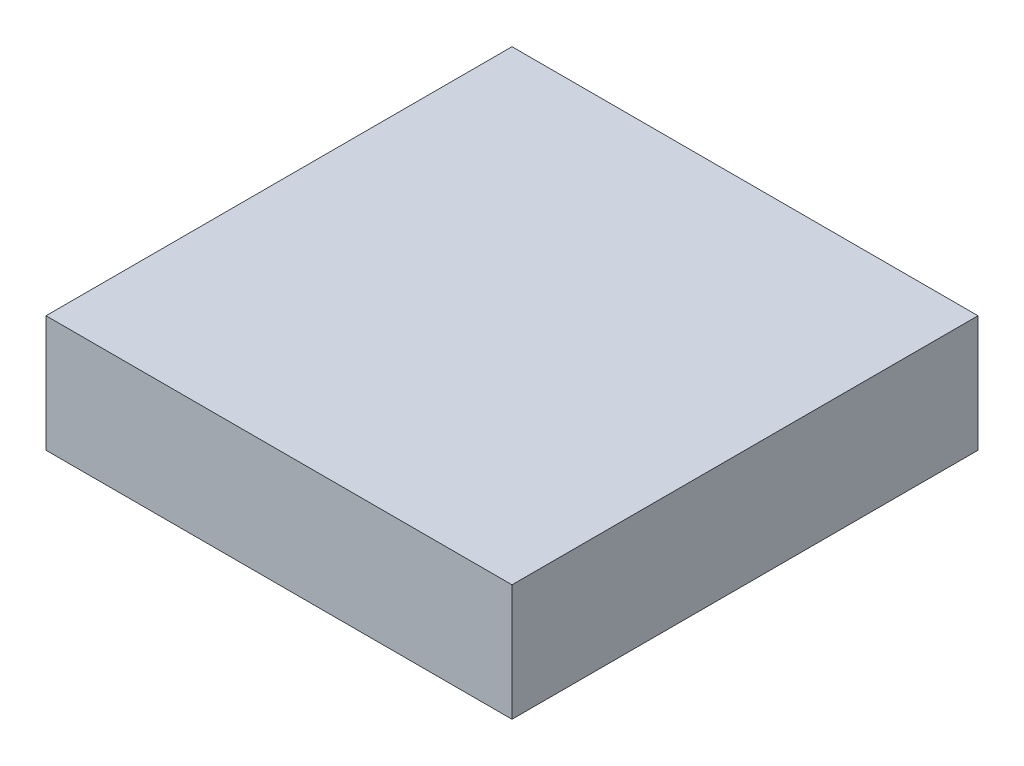
ISO-10303-21;
HEADER;
FILE_DESCRIPTION(('STEP AP214'),'2;1');
FILE_NAME('part.step','',(''),(''),'','','');
FILE_SCHEMA(('AUTOMOTIVE_DESIGN { 1 0 10303 214 1 1 1 1 }'));
ENDSEC;
DATA;
#1=APPLICATION_CONTEXT('core data for automotive mechanical design processes');
#2=APPLICATION_PROTOCOL_DEFINITION('international standard','automotive_design',2000,#1);
#3=PRODUCT_CONTEXT('',#1,'mechanical');
#4=PRODUCT('Part','Part','',(#3));
#5=PRODUCT_RELATED_PRODUCT_CATEGORY('part','',(#4));
#6=PRODUCT_DEFINITION_FORMATION('','',#4);
#7=PRODUCT_DEFINITION_CONTEXT('part definition',#1,'design');
#8=PRODUCT_DEFINITION('design','',#6,#7);
#9=PRODUCT_DEFINITION_SHAPE('','',#8);
#10=(LENGTH_UNIT() NAMED_UNIT(*) SI_UNIT(.MILLI.,.METRE.));
#11=(NAMED_UNIT(*) PLANE_ANGLE_UNIT() SI_UNIT($,.RADIAN.));
#12=(NAMED_UNIT(*) SI_UNIT($,.STERADIAN.) SOLID_ANGLE_UNIT());
#13=UNCERTAINTY_MEASURE_WITH_UNIT(LENGTH_MEASURE(1.E-05),#10,'distance_accuracy_value','');
#14=(GEOMETRIC_REPRESENTATION_CONTEXT(3) GLOBAL_UNCERTAINTY_ASSIGNED_CONTEXT((#13)) GLOBAL_UNIT_ASSIGNED_CONTEXT((#10,
#11,#12)) REPRESENTATION_CONTEXT('',''));
#15=CARTESIAN_POINT('',(0.,0.,0.));
#16=DIRECTION('',(0.,0.,1.));
#17=DIRECTION('',(1.,0.,0.));
#18=AXIS2_PLACEMENT_3D('',#15,#16,#17);
#19=CARTESIAN_POINT('',(0.,1.,0.));
#20=DIRECTION('',(-1.,0.,0.));
#21=DIRECTION('',(0.,0.,1.));
#22=AXIS2_PLACEMENT_3D('',#19,#20,#21);
#23=PLANE('',#22);
#24=DIRECTION('',(0.,0.,-1.));
#25=VECTOR('',#24,1.);
#26=CARTESIAN_POINT('',(0.,0.,0.));
#27=LINE('',#26,#25);
#28=CARTESIAN_POINT('',(0.,0.,0.));
#29=VERTEX_POINT('',#28);
#30=CARTESIAN_POINT('',(0.,0.,-4.));
#31=VERTEX_POINT('',#30);
#32=EDGE_CURVE('E99',#29,#31,#27,.T.);
#33=ORIENTED_EDGE('',*,*,#32,.F.);
#34=DIRECTION('',(0.,-1.,0.));
#35=VECTOR('',#34,1.);
#36=CARTESIAN_POINT('',(0.,1.,0.));
#37=LINE('',#36,#35);
#38=CARTESIAN_POINT('',(0.,1.,0.));
#39=VERTEX_POINT('',#38);
#40=EDGE_CURVE('E11',#39,#29,#37,.T.);
#41=ORIENTED_EDGE('',*,*,#40,.F.);
#42=DIRECTION('',(0.,0.,-1.));
#43=VECTOR('',#42,1.);
#44=CARTESIAN_POINT('',(0.,1.,0.));
#45=LINE('',#44,#43);
#46=CARTESIAN_POINT('',(0.,1.,-4.));
#47=VERTEX_POINT('',#46);
#48=EDGE_CURVE('E94',#39,#47,#45,.T.);
#49=ORIENTED_EDGE('',*,*,#48,.T.);
#50=DIRECTION('',(0.,-1.,0.));
#51=VECTOR('',#50,1.);
#52=CARTESIAN_POINT('',(0.,1.,-4.));
#53=LINE('',#52,#51);
#54=EDGE_CURVE('E37',#47,#31,#53,.T.);
#55=ORIENTED_EDGE('',*,*,#54,.T.);
#56=EDGE_LOOP('',(#33,#41,#49,#55));
#57=FACE_BOUND('',#56,.T.);
#58=ADVANCED_FACE('F34',(#57),#23,.T.);
#59=CARTESIAN_POINT('',(0.,1.,0.));
#60=DIRECTION('',(0.,0.,-1.));
#61=DIRECTION('',(-1.,0.,0.));
#62=AXIS2_PLACEMENT_3D('',#59,#60,#61);
#63=PLANE('',#62);
#64=DIRECTION('',(1.,0.,0.));
#65=VECTOR('',#64,1.);
#66=CARTESIAN_POINT('',(0.,0.,0.));
#67=LINE('',#66,#65);
#68=CARTESIAN_POINT('',(4.,0.,0.));
#69=VERTEX_POINT('',#68);
#70=EDGE_CURVE('E67',#29,#69,#67,.T.);
#71=ORIENTED_EDGE('',*,*,#70,.T.);
#72=DIRECTION('',(0.,-1.,0.));
#73=VECTOR('',#72,1.);
#74=CARTESIAN_POINT('',(4.,1.,0.));
#75=LINE('',#74,#73);
#76=CARTESIAN_POINT('',(4.,1.,0.));
#77=VERTEX_POINT('',#76);
#78=EDGE_CURVE('E43',#77,#69,#75,.T.);
#79=ORIENTED_EDGE('',*,*,#78,.F.);
#80=DIRECTION('',(1.,0.,0.));
#81=VECTOR('',#80,1.);
#82=CARTESIAN_POINT('',(0.,1.,0.));
#83=LINE('',#82,#81);
#84=EDGE_CURVE('E84',#39,#77,#83,.T.);
#85=ORIENTED_EDGE('',*,*,#84,.F.);
#86=ORIENTED_EDGE('',*,*,#40,.T.);
#87=EDGE_LOOP('',(#71,#79,#85,#86));
#88=FACE_BOUND('',#87,.T.);
#89=ADVANCED_FACE('F109',(#88),#63,.F.);
#90=CARTESIAN_POINT('',(4.,1.,0.));
#91=DIRECTION('',(-1.,0.,0.));
#92=DIRECTION('',(0.,0.,1.));
#93=AXIS2_PLACEMENT_3D('',#90,#91,#92);
#94=PLANE('',#93);
#95=DIRECTION('',(0.,0.,-1.));
#96=VECTOR('',#95,1.);
#97=CARTESIAN_POINT('',(4.,0.,0.));
#98=LINE('',#97,#96);
#99=CARTESIAN_POINT('',(4.,0.,-4.));
#100=VERTEX_POINT('',#99);
#101=EDGE_CURVE('E91',#69,#100,#98,.T.);
#102=ORIENTED_EDGE('',*,*,#101,.T.);
#103=DIRECTION('',(0.,-1.,0.));
#104=VECTOR('',#103,1.);
#105=CARTESIAN_POINT('',(4.,1.,-4.));
#106=LINE('',#105,#104);
#107=CARTESIAN_POINT('',(4.,1.,-4.));
#108=VERTEX_POINT('',#107);
#109=EDGE_CURVE('E88',#108,#100,#106,.T.);
#110=ORIENTED_EDGE('',*,*,#109,.F.);
#111=DIRECTION('',(0.,0.,-1.));
#112=VECTOR('',#111,1.);
#113=CARTESIAN_POINT('',(4.,1.,0.));
#114=LINE('',#113,#112);
#115=EDGE_CURVE('E79',#77,#108,#114,.T.);
#116=ORIENTED_EDGE('',*,*,#115,.F.);
#117=ORIENTED_EDGE('',*,*,#78,.T.);
#118=EDGE_LOOP('',(#102,#110,#116,#117));
#119=FACE_BOUND('',#118,.T.);
#120=ADVANCED_FACE('F89',(#119),#94,.F.);
#121=CARTESIAN_POINT('',(0.,1.,-4.));
#122=DIRECTION('',(0.,0.,-1.));
#123=DIRECTION('',(-1.,0.,0.));
#124=AXIS2_PLACEMENT_3D('',#121,#122,#123);
#125=PLANE('',#124);
#126=DIRECTION('',(1.,0.,0.));
#127=VECTOR('',#126,1.);
#128=CARTESIAN_POINT('',(0.,0.,-4.));
#129=LINE('',#128,#127);
#130=EDGE_CURVE('E102',#31,#100,#129,.T.);
#131=ORIENTED_EDGE('',*,*,#130,.F.);
#132=ORIENTED_EDGE('',*,*,#54,.F.);
#133=DIRECTION('',(1.,0.,0.));
#134=VECTOR('',#133,1.);
#135=CARTESIAN_POINT('',(0.,1.,-4.));
#136=LINE('',#135,#134);
#137=EDGE_CURVE('E83',#47,#108,#136,.T.);
#138=ORIENTED_EDGE('',*,*,#137,.T.);
#139=ORIENTED_EDGE('',*,*,#109,.T.);
#140=EDGE_LOOP('',(#131,#132,#138,#139));
#141=FACE_BOUND('',#140,.T.);
#142=ADVANCED_FACE('F93',(#141),#125,.T.);
#143=CARTESIAN_POINT('',(0.,1.,0.));
#144=DIRECTION('',(0.,-1.,0.));
#145=DIRECTION('',(0.,0.,-1.));
#146=AXIS2_PLACEMENT_3D('',#143,#144,#145);
#147=PLANE('',#146);
#148=ORIENTED_EDGE('',*,*,#48,.F.);
#149=ORIENTED_EDGE('',*,*,#84,.T.);
#150=ORIENTED_EDGE('',*,*,#115,.T.);
#151=ORIENTED_EDGE('',*,*,#137,.F.);
#152=EDGE_LOOP('',(#148,#149,#150,#151));
#153=FACE_BOUND('',#152,.T.);
#154=ADVANCED_FACE('F82',(#153),#147,.F.);
#155=CARTESIAN_POINT('',(0.,0.,0.));
#156=DIRECTION('',(0.,-1.,0.));
#157=DIRECTION('',(0.,0.,-1.));
#158=AXIS2_PLACEMENT_3D('',#155,#156,#157);
#159=PLANE('',#158);
#160=ORIENTED_EDGE('',*,*,#32,.T.);
#161=ORIENTED_EDGE('',*,*,#130,.T.);
#162=ORIENTED_EDGE('',*,*,#101,.F.);
#163=ORIENTED_EDGE('',*,*,#70,.F.);
#164=EDGE_LOOP('',(#160,#161,#162,#163));
#165=FACE_BOUND('',#164,.T.);
#166=ADVANCED_FACE('F107',(#165),#159,.T.);
#167=CLOSED_SHELL('',(#58,#89,#120,#142,#154,#166));
#168=MANIFOLD_SOLID_BREP('B2',#167);
#169=ADVANCED_BREP_SHAPE_REPRESENTATION('',(#18,#168),#14);
#170=SHAPE_DEFINITION_REPRESENTATION(#9,#169);
ENDSEC;
END-ISO-10303-21;
